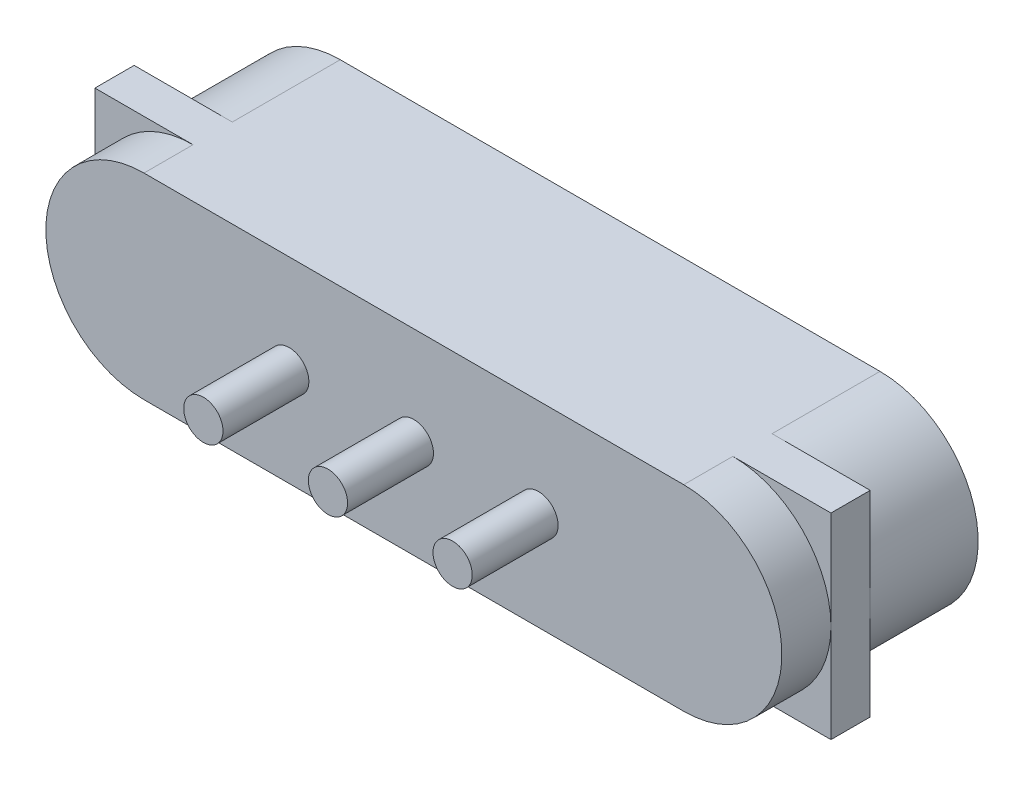
ISO-10303-21;
HEADER;
FILE_DESCRIPTION(('STEP AP214'),'2;1');
FILE_NAME('part.step','',(''),(''),'','','');
FILE_SCHEMA(('AUTOMOTIVE_DESIGN { 1 0 10303 214 1 1 1 1 }'));
ENDSEC;
DATA;
#1=APPLICATION_CONTEXT('core data for automotive mechanical design processes');
#2=APPLICATION_PROTOCOL_DEFINITION('international standard','automotive_design',2000,#1);
#3=PRODUCT_CONTEXT('',#1,'mechanical');
#4=PRODUCT('Part','Part','',(#3));
#5=PRODUCT_RELATED_PRODUCT_CATEGORY('part','',(#4));
#6=PRODUCT_DEFINITION_FORMATION('','',#4);
#7=PRODUCT_DEFINITION_CONTEXT('part definition',#1,'design');
#8=PRODUCT_DEFINITION('design','',#6,#7);
#9=PRODUCT_DEFINITION_SHAPE('','',#8);
#10=(LENGTH_UNIT() NAMED_UNIT(*) SI_UNIT(.MILLI.,.METRE.));
#11=(NAMED_UNIT(*) PLANE_ANGLE_UNIT() SI_UNIT($,.RADIAN.));
#12=(NAMED_UNIT(*) SI_UNIT($,.STERADIAN.) SOLID_ANGLE_UNIT());
#13=UNCERTAINTY_MEASURE_WITH_UNIT(LENGTH_MEASURE(1.E-05),#10,'distance_accuracy_value','');
#14=(GEOMETRIC_REPRESENTATION_CONTEXT(3) GLOBAL_UNCERTAINTY_ASSIGNED_CONTEXT((#13)) GLOBAL_UNIT_ASSIGNED_CONTEXT((#10,
#11,#12)) REPRESENTATION_CONTEXT('',''));
#15=CARTESIAN_POINT('',(0.,0.,0.));
#16=DIRECTION('',(0.,0.,1.));
#17=DIRECTION('',(1.,0.,0.));
#18=AXIS2_PLACEMENT_3D('',#15,#16,#17);
#19=CARTESIAN_POINT('',(0.,0.,4.));
#20=DIRECTION('',(0.,0.,-1.));
#21=DIRECTION('',(-1.,0.,0.));
#22=AXIS2_PLACEMENT_3D('',#19,#20,#21);
#23=CYLINDRICAL_SURFACE('',#22,2.);
#24=CARTESIAN_POINT('',(0.,0.,3.));
#25=DIRECTION('',(0.,0.,-1.));
#26=DIRECTION('',(-1.,0.,0.));
#27=AXIS2_PLACEMENT_3D('',#24,#25,#26);
#28=CIRCLE('',#27,2.);
#29=CARTESIAN_POINT('',(-2.,0.,3.));
#30=VERTEX_POINT('',#29);
#31=CARTESIAN_POINT('',(0.,2.,3.));
#32=VERTEX_POINT('',#31);
#33=EDGE_CURVE('E199',#30,#32,#28,.T.);
#34=ORIENTED_EDGE('',*,*,#33,.F.);
#35=CARTESIAN_POINT('',(0.,-2.,3.));
#36=VERTEX_POINT('',#35);
#37=EDGE_CURVE('E197',#36,#30,#28,.T.);
#38=ORIENTED_EDGE('',*,*,#37,.F.);
#39=DIRECTION('',(0.,0.,-1.));
#40=VECTOR('',#39,1.);
#41=CARTESIAN_POINT('',(0.,-2.,4.));
#42=LINE('',#41,#40);
#43=CARTESIAN_POINT('',(0.,-2.,4.));
#44=VERTEX_POINT('',#43);
#45=EDGE_CURVE('E233',#44,#36,#42,.T.);
#46=ORIENTED_EDGE('',*,*,#45,.F.);
#47=CARTESIAN_POINT('',(0.,0.,4.));
#48=DIRECTION('',(0.,0.,1.));
#49=DIRECTION('',(1.,0.,0.));
#50=AXIS2_PLACEMENT_3D('',#47,#48,#49);
#51=CIRCLE('',#50,2.);
#52=CARTESIAN_POINT('',(0.,2.,4.));
#53=VERTEX_POINT('',#52);
#54=EDGE_CURVE('E200',#53,#44,#51,.T.);
#55=ORIENTED_EDGE('',*,*,#54,.F.);
#56=DIRECTION('',(0.,0.,-1.));
#57=VECTOR('',#56,1.);
#58=CARTESIAN_POINT('',(0.,2.,4.));
#59=LINE('',#58,#57);
#60=EDGE_CURVE('E222',#53,#32,#59,.T.);
#61=ORIENTED_EDGE('',*,*,#60,.T.);
#62=EDGE_LOOP('',(#34,#38,#46,#55,#61));
#63=FACE_BOUND('',#62,.T.);
#64=ADVANCED_FACE('F32',(#63),#23,.T.);
#65=CARTESIAN_POINT('',(11.,0.,4.));
#66=DIRECTION('',(0.,0.,-1.));
#67=DIRECTION('',(-1.,0.,0.));
#68=AXIS2_PLACEMENT_3D('',#65,#66,#67);
#69=CYLINDRICAL_SURFACE('',#68,2.);
#70=CARTESIAN_POINT('',(11.,0.,3.));
#71=DIRECTION('',(0.,0.,-1.));
#72=DIRECTION('',(-1.,0.,0.));
#73=AXIS2_PLACEMENT_3D('',#70,#71,#72);
#74=CIRCLE('',#73,2.);
#75=CARTESIAN_POINT('',(11.,2.,3.));
#76=VERTEX_POINT('',#75);
#77=CARTESIAN_POINT('',(13.,0.,3.));
#78=VERTEX_POINT('',#77);
#79=EDGE_CURVE('E196',#76,#78,#74,.T.);
#80=ORIENTED_EDGE('',*,*,#79,.F.);
#81=DIRECTION('',(0.,0.,-1.));
#82=VECTOR('',#81,1.);
#83=CARTESIAN_POINT('',(11.,2.,4.));
#84=LINE('',#83,#82);
#85=CARTESIAN_POINT('',(11.,2.,4.));
#86=VERTEX_POINT('',#85);
#87=EDGE_CURVE('E226',#86,#76,#84,.T.);
#88=ORIENTED_EDGE('',*,*,#87,.F.);
#89=CARTESIAN_POINT('',(11.,0.,4.));
#90=DIRECTION('',(0.,0.,1.));
#91=DIRECTION('',(1.,0.,0.));
#92=AXIS2_PLACEMENT_3D('',#89,#90,#91);
#93=CIRCLE('',#92,2.);
#94=CARTESIAN_POINT('',(11.,-2.,4.));
#95=VERTEX_POINT('',#94);
#96=EDGE_CURVE('E206',#95,#86,#93,.T.);
#97=ORIENTED_EDGE('',*,*,#96,.F.);
#98=DIRECTION('',(0.,0.,-1.));
#99=VECTOR('',#98,1.);
#100=CARTESIAN_POINT('',(11.,-2.,4.));
#101=LINE('',#100,#99);
#102=CARTESIAN_POINT('',(11.,-2.,3.));
#103=VERTEX_POINT('',#102);
#104=EDGE_CURVE('E230',#95,#103,#101,.T.);
#105=ORIENTED_EDGE('',*,*,#104,.T.);
#106=EDGE_CURVE('E158',#78,#103,#74,.T.);
#107=ORIENTED_EDGE('',*,*,#106,.F.);
#108=EDGE_LOOP('',(#80,#88,#97,#105,#107));
#109=FACE_BOUND('',#108,.T.);
#110=ADVANCED_FACE('F266',(#109),#69,.T.);
#111=CARTESIAN_POINT('',(0.,0.,2.2));
#112=DIRECTION('',(0.,0.,-1.));
#113=DIRECTION('',(-1.,0.,0.));
#114=AXIS2_PLACEMENT_3D('',#111,#112,#113);
#115=CIRCLE('',#114,2.);
#116=CARTESIAN_POINT('',(0.,-2.,2.2));
#117=VERTEX_POINT('',#116);
#118=CARTESIAN_POINT('',(-2.,0.,2.2));
#119=VERTEX_POINT('',#118);
#120=EDGE_CURVE('E191',#117,#119,#115,.T.);
#121=ORIENTED_EDGE('',*,*,#120,.T.);
#122=CARTESIAN_POINT('',(0.,2.,2.2));
#123=VERTEX_POINT('',#122);
#124=EDGE_CURVE('E194',#119,#123,#115,.T.);
#125=ORIENTED_EDGE('',*,*,#124,.T.);
#126=CARTESIAN_POINT('',(0.,2.,0.));
#127=VERTEX_POINT('',#126);
#128=EDGE_CURVE('E210',#123,#127,#59,.T.);
#129=ORIENTED_EDGE('',*,*,#128,.T.);
#130=CARTESIAN_POINT('',(0.,0.,0.));
#131=DIRECTION('',(0.,0.,1.));
#132=DIRECTION('',(1.,0.,0.));
#133=AXIS2_PLACEMENT_3D('',#130,#131,#132);
#134=CIRCLE('',#133,2.);
#135=CARTESIAN_POINT('',(0.,-2.,0.));
#136=VERTEX_POINT('',#135);
#137=EDGE_CURVE('E211',#127,#136,#134,.T.);
#138=ORIENTED_EDGE('',*,*,#137,.T.);
#139=EDGE_CURVE('E232',#117,#136,#42,.T.);
#140=ORIENTED_EDGE('',*,*,#139,.F.);
#141=EDGE_LOOP('',(#121,#125,#129,#138,#140));
#142=FACE_BOUND('',#141,.T.);
#143=ADVANCED_FACE('F269',(#142),#23,.T.);
#144=CARTESIAN_POINT('',(0.,-2.,4.));
#145=DIRECTION('',(0.,1.,0.));
#146=DIRECTION('',(-1.,0.,0.));
#147=AXIS2_PLACEMENT_3D('',#144,#145,#146);
#148=PLANE('',#147);
#149=CARTESIAN_POINT('',(11.,-2.,2.2));
#150=VERTEX_POINT('',#149);
#151=CARTESIAN_POINT('',(11.,-2.,0.));
#152=VERTEX_POINT('',#151);
#153=EDGE_CURVE('E229',#150,#152,#101,.T.);
#154=ORIENTED_EDGE('',*,*,#153,.F.);
#155=DIRECTION('',(-1.,0.,0.));
#156=VECTOR('',#155,1.);
#157=CARTESIAN_POINT('',(13.,-2.,2.2));
#158=LINE('',#157,#156);
#159=CARTESIAN_POINT('',(13.,-2.,2.2));
#160=VERTEX_POINT('',#159);
#161=EDGE_CURVE('E55',#160,#150,#158,.T.);
#162=ORIENTED_EDGE('',*,*,#161,.F.);
#163=DIRECTION('',(0.,0.,-1.));
#164=VECTOR('',#163,1.);
#165=CARTESIAN_POINT('',(13.,-2.,3.));
#166=LINE('',#165,#164);
#167=CARTESIAN_POINT('',(13.,-2.,3.));
#168=VERTEX_POINT('',#167);
#169=EDGE_CURVE('E138',#168,#160,#166,.T.);
#170=ORIENTED_EDGE('',*,*,#169,.F.);
#171=DIRECTION('',(-1.,0.,0.));
#172=VECTOR('',#171,1.);
#173=CARTESIAN_POINT('',(13.,-2.,3.));
#174=LINE('',#173,#172);
#175=EDGE_CURVE('E152',#168,#103,#174,.T.);
#176=ORIENTED_EDGE('',*,*,#175,.T.);
#177=ORIENTED_EDGE('',*,*,#104,.F.);
#178=DIRECTION('',(1.,0.,0.));
#179=VECTOR('',#178,1.);
#180=CARTESIAN_POINT('',(0.,-2.,4.));
#181=LINE('',#180,#179);
#182=EDGE_CURVE('E203',#44,#95,#181,.T.);
#183=ORIENTED_EDGE('',*,*,#182,.F.);
#184=ORIENTED_EDGE('',*,*,#45,.T.);
#185=CARTESIAN_POINT('',(-2.,-2.,3.));
#186=VERTEX_POINT('',#185);
#187=EDGE_CURVE('E160',#36,#186,#174,.T.);
#188=ORIENTED_EDGE('',*,*,#187,.T.);
#189=DIRECTION('',(0.,0.,-1.));
#190=VECTOR('',#189,1.);
#191=CARTESIAN_POINT('',(-2.,-2.,3.));
#192=LINE('',#191,#190);
#193=CARTESIAN_POINT('',(-2.,-2.,2.2));
#194=VERTEX_POINT('',#193);
#195=EDGE_CURVE('E154',#186,#194,#192,.T.);
#196=ORIENTED_EDGE('',*,*,#195,.T.);
#197=EDGE_CURVE('E173',#117,#194,#158,.T.);
#198=ORIENTED_EDGE('',*,*,#197,.F.);
#199=ORIENTED_EDGE('',*,*,#139,.T.);
#200=DIRECTION('',(1.,0.,0.));
#201=VECTOR('',#200,1.);
#202=CARTESIAN_POINT('',(0.,-2.,0.));
#203=LINE('',#202,#201);
#204=EDGE_CURVE('E214',#136,#152,#203,.T.);
#205=ORIENTED_EDGE('',*,*,#204,.T.);
#206=EDGE_LOOP('',(#154,#162,#170,#176,#177,#183,#184,#188,#196,#198,#199,#205));
#207=FACE_BOUND('',#206,.T.);
#208=ADVANCED_FACE('F150',(#207),#148,.F.);
#209=CARTESIAN_POINT('',(11.,2.,2.2));
#210=VERTEX_POINT('',#209);
#211=CARTESIAN_POINT('',(11.,2.,0.));
#212=VERTEX_POINT('',#211);
#213=EDGE_CURVE('E225',#210,#212,#84,.T.);
#214=ORIENTED_EDGE('',*,*,#213,.F.);
#215=CARTESIAN_POINT('',(11.,0.,2.2));
#216=DIRECTION('',(0.,0.,-1.));
#217=DIRECTION('',(-1.,0.,0.));
#218=AXIS2_PLACEMENT_3D('',#215,#216,#217);
#219=CIRCLE('',#218,2.);
#220=CARTESIAN_POINT('',(13.,0.,2.2));
#221=VERTEX_POINT('',#220);
#222=EDGE_CURVE('E190',#210,#221,#219,.T.);
#223=ORIENTED_EDGE('',*,*,#222,.T.);
#224=EDGE_CURVE('E183',#221,#150,#219,.T.);
#225=ORIENTED_EDGE('',*,*,#224,.T.);
#226=ORIENTED_EDGE('',*,*,#153,.T.);
#227=CARTESIAN_POINT('',(11.,0.,0.));
#228=DIRECTION('',(0.,0.,1.));
#229=DIRECTION('',(1.,0.,0.));
#230=AXIS2_PLACEMENT_3D('',#227,#228,#229);
#231=CIRCLE('',#230,2.);
#232=EDGE_CURVE('E217',#152,#212,#231,.T.);
#233=ORIENTED_EDGE('',*,*,#232,.T.);
#234=EDGE_LOOP('',(#214,#223,#225,#226,#233));
#235=FACE_BOUND('',#234,.T.);
#236=ADVANCED_FACE('F275',(#235),#69,.T.);
#237=CARTESIAN_POINT('',(0.,2.,4.));
#238=DIRECTION('',(0.,-1.,0.));
#239=DIRECTION('',(1.,0.,0.));
#240=AXIS2_PLACEMENT_3D('',#237,#238,#239);
#241=PLANE('',#240);
#242=ORIENTED_EDGE('',*,*,#128,.F.);
#243=DIRECTION('',(1.,0.,0.));
#244=VECTOR('',#243,1.);
#245=CARTESIAN_POINT('',(13.,2.,2.2));
#246=LINE('',#245,#244);
#247=CARTESIAN_POINT('',(-2.,2.,2.2));
#248=VERTEX_POINT('',#247);
#249=EDGE_CURVE('E145',#248,#123,#246,.T.);
#250=ORIENTED_EDGE('',*,*,#249,.F.);
#251=DIRECTION('',(0.,0.,-1.));
#252=VECTOR('',#251,1.);
#253=CARTESIAN_POINT('',(-2.,2.,3.));
#254=LINE('',#253,#252);
#255=CARTESIAN_POINT('',(-2.,2.,3.));
#256=VERTEX_POINT('',#255);
#257=EDGE_CURVE('E184',#256,#248,#254,.T.);
#258=ORIENTED_EDGE('',*,*,#257,.F.);
#259=DIRECTION('',(1.,0.,0.));
#260=VECTOR('',#259,1.);
#261=CARTESIAN_POINT('',(13.,2.,3.));
#262=LINE('',#261,#260);
#263=EDGE_CURVE('E155',#256,#32,#262,.T.);
#264=ORIENTED_EDGE('',*,*,#263,.T.);
#265=ORIENTED_EDGE('',*,*,#60,.F.);
#266=DIRECTION('',(-1.,0.,0.));
#267=VECTOR('',#266,1.);
#268=CARTESIAN_POINT('',(0.,2.,4.));
#269=LINE('',#268,#267);
#270=EDGE_CURVE('E208',#86,#53,#269,.T.);
#271=ORIENTED_EDGE('',*,*,#270,.F.);
#272=ORIENTED_EDGE('',*,*,#87,.T.);
#273=CARTESIAN_POINT('',(13.,2.,3.));
#274=VERTEX_POINT('',#273);
#275=EDGE_CURVE('E167',#76,#274,#262,.T.);
#276=ORIENTED_EDGE('',*,*,#275,.T.);
#277=DIRECTION('',(0.,0.,-1.));
#278=VECTOR('',#277,1.);
#279=CARTESIAN_POINT('',(13.,2.,3.));
#280=LINE('',#279,#278);
#281=CARTESIAN_POINT('',(13.,2.,2.2));
#282=VERTEX_POINT('',#281);
#283=EDGE_CURVE('E180',#274,#282,#280,.T.);
#284=ORIENTED_EDGE('',*,*,#283,.T.);
#285=EDGE_CURVE('E178',#210,#282,#246,.T.);
#286=ORIENTED_EDGE('',*,*,#285,.F.);
#287=ORIENTED_EDGE('',*,*,#213,.T.);
#288=DIRECTION('',(-1.,0.,0.));
#289=VECTOR('',#288,1.);
#290=CARTESIAN_POINT('',(0.,2.,0.));
#291=LINE('',#290,#289);
#292=EDGE_CURVE('E204',#212,#127,#291,.T.);
#293=ORIENTED_EDGE('',*,*,#292,.T.);
#294=EDGE_LOOP('',(#242,#250,#258,#264,#265,#271,#272,#276,#284,#286,#287,#293));
#295=FACE_BOUND('',#294,.T.);
#296=ADVANCED_FACE('F299',(#295),#241,.F.);
#297=CARTESIAN_POINT('',(0.,0.,4.));
#298=DIRECTION('',(0.,0.,1.));
#299=DIRECTION('',(1.,0.,0.));
#300=AXIS2_PLACEMENT_3D('',#297,#298,#299);
#301=PLANE('',#300);
#302=CARTESIAN_POINT('',(2.96,0.,4.));
#303=DIRECTION('',(0.,0.,1.));
#304=DIRECTION('',(1.,0.,0.));
#305=AXIS2_PLACEMENT_3D('',#302,#303,#304);
#306=CIRCLE('',#305,0.4);
#307=CARTESIAN_POINT('',(3.36,0.,4.));
#308=VERTEX_POINT('',#307);
#309=EDGE_CURVE('E510',#308,#308,#306,.T.);
#310=ORIENTED_EDGE('',*,*,#309,.F.);
#311=EDGE_LOOP('',(#310));
#312=FACE_BOUND('',#311,.T.);
#313=CARTESIAN_POINT('',(8.04,0.,4.));
#314=DIRECTION('',(0.,0.,1.));
#315=DIRECTION('',(1.,0.,0.));
#316=AXIS2_PLACEMENT_3D('',#313,#314,#315);
#317=CIRCLE('',#316,0.400000000000001);
#318=CARTESIAN_POINT('',(8.44,0.,4.));
#319=VERTEX_POINT('',#318);
#320=EDGE_CURVE('E509',#319,#319,#317,.T.);
#321=ORIENTED_EDGE('',*,*,#320,.F.);
#322=EDGE_LOOP('',(#321));
#323=FACE_BOUND('',#322,.T.);
#324=CARTESIAN_POINT('',(5.5,0.,4.));
#325=DIRECTION('',(0.,0.,1.));
#326=DIRECTION('',(1.,0.,0.));
#327=AXIS2_PLACEMENT_3D('',#324,#325,#326);
#328=CIRCLE('',#327,0.400000000000001);
#329=CARTESIAN_POINT('',(5.9,0.,4.));
#330=VERTEX_POINT('',#329);
#331=EDGE_CURVE('E519',#330,#330,#328,.T.);
#332=ORIENTED_EDGE('',*,*,#331,.F.);
#333=EDGE_LOOP('',(#332));
#334=FACE_BOUND('',#333,.T.);
#335=ORIENTED_EDGE('',*,*,#54,.T.);
#336=ORIENTED_EDGE('',*,*,#182,.T.);
#337=ORIENTED_EDGE('',*,*,#96,.T.);
#338=ORIENTED_EDGE('',*,*,#270,.T.);
#339=EDGE_LOOP('',(#335,#336,#337,#338));
#340=FACE_BOUND('',#339,.T.);
#341=ADVANCED_FACE('F324',(#312,#323,#334,#340),#301,.T.);
#342=CARTESIAN_POINT('',(0.,0.,0.));
#343=DIRECTION('',(0.,0.,1.));
#344=DIRECTION('',(1.,0.,0.));
#345=AXIS2_PLACEMENT_3D('',#342,#343,#344);
#346=PLANE('',#345);
#347=CARTESIAN_POINT('',(2.96,0.,0.));
#348=DIRECTION('',(0.,0.,1.));
#349=DIRECTION('',(1.,0.,0.));
#350=AXIS2_PLACEMENT_3D('',#347,#348,#349);
#351=CIRCLE('',#350,0.5);
#352=CARTESIAN_POINT('',(3.46,0.,0.));
#353=VERTEX_POINT('',#352);
#354=EDGE_CURVE('E242',#353,#353,#351,.F.);
#355=ORIENTED_EDGE('',*,*,#354,.F.);
#356=EDGE_LOOP('',(#355));
#357=FACE_BOUND('',#356,.T.);
#358=CARTESIAN_POINT('',(5.5,0.,0.));
#359=DIRECTION('',(0.,0.,1.));
#360=DIRECTION('',(1.,0.,0.));
#361=AXIS2_PLACEMENT_3D('',#358,#359,#360);
#362=CIRCLE('',#361,0.500000000000001);
#363=CARTESIAN_POINT('',(6.,0.,0.));
#364=VERTEX_POINT('',#363);
#365=EDGE_CURVE('E239',#364,#364,#362,.F.);
#366=ORIENTED_EDGE('',*,*,#365,.F.);
#367=EDGE_LOOP('',(#366));
#368=FACE_BOUND('',#367,.T.);
#369=CARTESIAN_POINT('',(8.04,0.,0.));
#370=DIRECTION('',(0.,0.,1.));
#371=DIRECTION('',(1.,0.,0.));
#372=AXIS2_PLACEMENT_3D('',#369,#370,#371);
#373=CIRCLE('',#372,0.500000000000001);
#374=CARTESIAN_POINT('',(8.54,0.,0.));
#375=VERTEX_POINT('',#374);
#376=EDGE_CURVE('E236',#375,#375,#373,.F.);
#377=ORIENTED_EDGE('',*,*,#376,.F.);
#378=EDGE_LOOP('',(#377));
#379=FACE_BOUND('',#378,.T.);
#380=ORIENTED_EDGE('',*,*,#137,.F.);
#381=ORIENTED_EDGE('',*,*,#292,.F.);
#382=ORIENTED_EDGE('',*,*,#232,.F.);
#383=ORIENTED_EDGE('',*,*,#204,.F.);
#384=EDGE_LOOP('',(#380,#381,#382,#383));
#385=FACE_BOUND('',#384,.T.);
#386=ADVANCED_FACE('F304',(#357,#368,#379,#385),#346,.F.);
#387=CARTESIAN_POINT('',(13.,2.,3.));
#388=DIRECTION('',(1.,0.,0.));
#389=DIRECTION('',(0.,0.,-1.));
#390=AXIS2_PLACEMENT_3D('',#387,#388,#389);
#391=PLANE('',#390);
#392=DIRECTION('',(0.,-1.,0.));
#393=VECTOR('',#392,1.);
#394=CARTESIAN_POINT('',(13.,2.,2.2));
#395=LINE('',#394,#393);
#396=EDGE_CURVE('E174',#221,#160,#395,.T.);
#397=ORIENTED_EDGE('',*,*,#396,.F.);
#398=EDGE_CURVE('E170',#282,#221,#395,.T.);
#399=ORIENTED_EDGE('',*,*,#398,.F.);
#400=ORIENTED_EDGE('',*,*,#283,.F.);
#401=DIRECTION('',(0.,-1.,0.));
#402=VECTOR('',#401,1.);
#403=CARTESIAN_POINT('',(13.,2.,3.));
#404=LINE('',#403,#402);
#405=EDGE_CURVE('E141',#274,#78,#404,.T.);
#406=ORIENTED_EDGE('',*,*,#405,.T.);
#407=EDGE_CURVE('E134',#78,#168,#404,.T.);
#408=ORIENTED_EDGE('',*,*,#407,.T.);
#409=ORIENTED_EDGE('',*,*,#169,.T.);
#410=EDGE_LOOP('',(#397,#399,#400,#406,#408,#409));
#411=FACE_BOUND('',#410,.T.);
#412=ADVANCED_FACE('F137',(#411),#391,.T.);
#413=CARTESIAN_POINT('',(0.,0.,2.2));
#414=DIRECTION('',(0.,0.,-1.));
#415=DIRECTION('',(-1.,0.,0.));
#416=AXIS2_PLACEMENT_3D('',#413,#414,#415);
#417=PLANE('',#416);
#418=ORIENTED_EDGE('',*,*,#224,.F.);
#419=ORIENTED_EDGE('',*,*,#396,.T.);
#420=ORIENTED_EDGE('',*,*,#161,.T.);
#421=EDGE_LOOP('',(#418,#419,#420));
#422=FACE_BOUND('',#421,.T.);
#423=ADVANCED_FACE('F309',(#422),#417,.T.);
#424=CARTESIAN_POINT('',(0.,0.,3.));
#425=DIRECTION('',(0.,0.,-1.));
#426=DIRECTION('',(-1.,0.,0.));
#427=AXIS2_PLACEMENT_3D('',#424,#425,#426);
#428=PLANE('',#427);
#429=ORIENTED_EDGE('',*,*,#407,.F.);
#430=ORIENTED_EDGE('',*,*,#106,.T.);
#431=ORIENTED_EDGE('',*,*,#175,.F.);
#432=EDGE_LOOP('',(#429,#430,#431));
#433=FACE_BOUND('',#432,.T.);
#434=ADVANCED_FACE('F157',(#433),#428,.F.);
#435=ORIENTED_EDGE('',*,*,#222,.F.);
#436=ORIENTED_EDGE('',*,*,#285,.T.);
#437=ORIENTED_EDGE('',*,*,#398,.T.);
#438=EDGE_LOOP('',(#435,#436,#437));
#439=FACE_BOUND('',#438,.T.);
#440=ADVANCED_FACE('F313',(#439),#417,.T.);
#441=ORIENTED_EDGE('',*,*,#275,.F.);
#442=ORIENTED_EDGE('',*,*,#79,.T.);
#443=ORIENTED_EDGE('',*,*,#405,.F.);
#444=EDGE_LOOP('',(#441,#442,#443));
#445=FACE_BOUND('',#444,.T.);
#446=ADVANCED_FACE('F316',(#445),#428,.F.);
#447=CARTESIAN_POINT('',(-2.,2.,3.));
#448=DIRECTION('',(-1.,0.,0.));
#449=DIRECTION('',(0.,0.,1.));
#450=AXIS2_PLACEMENT_3D('',#447,#448,#449);
#451=PLANE('',#450);
#452=DIRECTION('',(0.,1.,0.));
#453=VECTOR('',#452,1.);
#454=CARTESIAN_POINT('',(-2.,2.,2.2));
#455=LINE('',#454,#453);
#456=EDGE_CURVE('E176',#119,#248,#455,.T.);
#457=ORIENTED_EDGE('',*,*,#456,.F.);
#458=EDGE_CURVE('E47',#194,#119,#455,.T.);
#459=ORIENTED_EDGE('',*,*,#458,.F.);
#460=ORIENTED_EDGE('',*,*,#195,.F.);
#461=DIRECTION('',(0.,1.,0.));
#462=VECTOR('',#461,1.);
#463=CARTESIAN_POINT('',(-2.,2.,3.));
#464=LINE('',#463,#462);
#465=EDGE_CURVE('E162',#186,#30,#464,.T.);
#466=ORIENTED_EDGE('',*,*,#465,.T.);
#467=EDGE_CURVE('E159',#30,#256,#464,.T.);
#468=ORIENTED_EDGE('',*,*,#467,.T.);
#469=ORIENTED_EDGE('',*,*,#257,.T.);
#470=EDGE_LOOP('',(#457,#459,#460,#466,#468,#469));
#471=FACE_BOUND('',#470,.T.);
#472=ADVANCED_FACE('F293',(#471),#451,.T.);
#473=ORIENTED_EDGE('',*,*,#467,.F.);
#474=ORIENTED_EDGE('',*,*,#33,.T.);
#475=ORIENTED_EDGE('',*,*,#263,.F.);
#476=EDGE_LOOP('',(#473,#474,#475));
#477=FACE_BOUND('',#476,.T.);
#478=ADVANCED_FACE('F331',(#477),#428,.F.);
#479=ORIENTED_EDGE('',*,*,#187,.F.);
#480=ORIENTED_EDGE('',*,*,#37,.T.);
#481=ORIENTED_EDGE('',*,*,#465,.F.);
#482=EDGE_LOOP('',(#479,#480,#481));
#483=FACE_BOUND('',#482,.T.);
#484=ADVANCED_FACE('F329',(#483),#428,.F.);
#485=ORIENTED_EDGE('',*,*,#124,.F.);
#486=ORIENTED_EDGE('',*,*,#456,.T.);
#487=ORIENTED_EDGE('',*,*,#249,.T.);
#488=EDGE_LOOP('',(#485,#486,#487));
#489=FACE_BOUND('',#488,.T.);
#490=ADVANCED_FACE('F297',(#489),#417,.T.);
#491=ORIENTED_EDGE('',*,*,#120,.F.);
#492=ORIENTED_EDGE('',*,*,#197,.T.);
#493=ORIENTED_EDGE('',*,*,#458,.T.);
#494=EDGE_LOOP('',(#491,#492,#493));
#495=FACE_BOUND('',#494,.T.);
#496=ADVANCED_FACE('F288',(#495),#417,.T.);
#497=CARTESIAN_POINT('',(8.04,0.,-1.));
#498=DIRECTION('',(0.,0.,1.));
#499=DIRECTION('',(1.,0.,0.));
#500=AXIS2_PLACEMENT_3D('',#497,#498,#499);
#501=CYLINDRICAL_SURFACE('',#500,0.500000000000001);
#502=CARTESIAN_POINT('',(8.04,0.,-0.5));
#503=DIRECTION('',(0.,0.,1.));
#504=DIRECTION('',(1.,0.,0.));
#505=AXIS2_PLACEMENT_3D('',#502,#503,#504);
#506=CIRCLE('',#505,0.500000000000001);
#507=CARTESIAN_POINT('',(8.54,0.,-0.5));
#508=VERTEX_POINT('',#507);
#509=EDGE_CURVE('E245',#508,#508,#506,.T.);
#510=ORIENTED_EDGE('',*,*,#509,.T.);
#511=EDGE_LOOP('',(#510));
#512=FACE_BOUND('',#511,.T.);
#513=ORIENTED_EDGE('',*,*,#376,.T.);
#514=EDGE_LOOP('',(#513));
#515=FACE_BOUND('',#514,.T.);
#516=ADVANCED_FACE('F381',(#512,#515),#501,.T.);
#517=CARTESIAN_POINT('',(5.5,0.,-1.));
#518=DIRECTION('',(0.,0.,1.));
#519=DIRECTION('',(1.,0.,0.));
#520=AXIS2_PLACEMENT_3D('',#517,#518,#519);
#521=CYLINDRICAL_SURFACE('',#520,0.500000000000001);
#522=CARTESIAN_POINT('',(5.5,0.,-0.5));
#523=DIRECTION('',(0.,0.,1.));
#524=DIRECTION('',(1.,0.,0.));
#525=AXIS2_PLACEMENT_3D('',#522,#523,#524);
#526=CIRCLE('',#525,0.500000000000001);
#527=CARTESIAN_POINT('',(6.,0.,-0.5));
#528=VERTEX_POINT('',#527);
#529=EDGE_CURVE('E40',#528,#528,#526,.T.);
#530=ORIENTED_EDGE('',*,*,#529,.T.);
#531=EDGE_LOOP('',(#530));
#532=FACE_BOUND('',#531,.T.);
#533=ORIENTED_EDGE('',*,*,#365,.T.);
#534=EDGE_LOOP('',(#533));
#535=FACE_BOUND('',#534,.T.);
#536=ADVANCED_FACE('F250',(#532,#535),#521,.T.);
#537=CARTESIAN_POINT('',(2.96,0.,-1.));
#538=DIRECTION('',(0.,0.,1.));
#539=DIRECTION('',(1.,0.,0.));
#540=AXIS2_PLACEMENT_3D('',#537,#538,#539);
#541=CYLINDRICAL_SURFACE('',#540,0.5);
#542=CARTESIAN_POINT('',(2.96,0.,-0.5));
#543=DIRECTION('',(0.,0.,1.));
#544=DIRECTION('',(1.,0.,0.));
#545=AXIS2_PLACEMENT_3D('',#542,#543,#544);
#546=CIRCLE('',#545,0.5);
#547=CARTESIAN_POINT('',(3.46,0.,-0.5));
#548=VERTEX_POINT('',#547);
#549=EDGE_CURVE('E11',#548,#548,#546,.T.);
#550=ORIENTED_EDGE('',*,*,#549,.T.);
#551=EDGE_LOOP('',(#550));
#552=FACE_BOUND('',#551,.T.);
#553=ORIENTED_EDGE('',*,*,#354,.T.);
#554=EDGE_LOOP('',(#553));
#555=FACE_BOUND('',#554,.T.);
#556=ADVANCED_FACE('F262',(#552,#555),#541,.T.);
#557=CARTESIAN_POINT('',(8.04,0.,-0.5));
#558=DIRECTION('',(0.,0.,-1.));
#559=DIRECTION('',(-1.,0.,0.));
#560=AXIS2_PLACEMENT_3D('',#557,#558,#559);
#561=SPHERICAL_SURFACE('',#560,0.5);
#562=ORIENTED_EDGE('',*,*,#509,.F.);
#563=EDGE_LOOP('',(#562));
#564=FACE_BOUND('',#563,.T.);
#565=ADVANCED_FACE('F255',(#564),#561,.T.);
#566=CARTESIAN_POINT('',(5.5,0.,-0.5));
#567=DIRECTION('',(0.,0.,-1.));
#568=DIRECTION('',(-1.,0.,0.));
#569=AXIS2_PLACEMENT_3D('',#566,#567,#568);
#570=SPHERICAL_SURFACE('',#569,0.5);
#571=ORIENTED_EDGE('',*,*,#529,.F.);
#572=EDGE_LOOP('',(#571));
#573=FACE_BOUND('',#572,.T.);
#574=ADVANCED_FACE('F253',(#573),#570,.T.);
#575=CARTESIAN_POINT('',(2.96,0.,-0.5));
#576=DIRECTION('',(0.,0.,-1.));
#577=DIRECTION('',(-1.,0.,0.));
#578=AXIS2_PLACEMENT_3D('',#575,#576,#577);
#579=SPHERICAL_SURFACE('',#578,0.5);
#580=ORIENTED_EDGE('',*,*,#549,.F.);
#581=EDGE_LOOP('',(#580));
#582=FACE_BOUND('',#581,.T.);
#583=ADVANCED_FACE('F34',(#582),#579,.T.);
#584=CARTESIAN_POINT('',(5.5,0.,5.75));
#585=DIRECTION('',(0.,0.,-1.));
#586=DIRECTION('',(-1.,0.,0.));
#587=AXIS2_PLACEMENT_3D('',#584,#585,#586);
#588=CYLINDRICAL_SURFACE('',#587,0.400000000000001);
#589=CARTESIAN_POINT('',(5.5,0.,5.75));
#590=DIRECTION('',(0.,0.,1.));
#591=DIRECTION('',(1.,0.,0.));
#592=AXIS2_PLACEMENT_3D('',#589,#590,#591);
#593=CIRCLE('',#592,0.400000000000001);
#594=CARTESIAN_POINT('',(5.9,0.,5.75));
#595=VERTEX_POINT('',#594);
#596=EDGE_CURVE('E311',#595,#595,#593,.T.);
#597=ORIENTED_EDGE('',*,*,#596,.F.);
#598=EDGE_LOOP('',(#597));
#599=FACE_BOUND('',#598,.T.);
#600=ORIENTED_EDGE('',*,*,#331,.T.);
#601=EDGE_LOOP('',(#600));
#602=FACE_BOUND('',#601,.T.);
#603=ADVANCED_FACE('F260',(#599,#602),#588,.T.);
#604=CARTESIAN_POINT('',(5.5,0.,5.75));
#605=DIRECTION('',(0.,0.,1.));
#606=DIRECTION('',(1.,0.,0.));
#607=AXIS2_PLACEMENT_3D('',#604,#605,#606);
#608=PLANE('',#607);
#609=ORIENTED_EDGE('',*,*,#596,.T.);
#610=EDGE_LOOP('',(#609));
#611=FACE_BOUND('',#610,.T.);
#612=ADVANCED_FACE('F452',(#611),#608,.T.);
#613=CARTESIAN_POINT('',(8.04,0.,5.75));
#614=DIRECTION('',(0.,0.,-1.));
#615=DIRECTION('',(-1.,0.,0.));
#616=AXIS2_PLACEMENT_3D('',#613,#614,#615);
#617=CYLINDRICAL_SURFACE('',#616,0.400000000000001);
#618=CARTESIAN_POINT('',(8.04,0.,5.75));
#619=DIRECTION('',(0.,0.,1.));
#620=DIRECTION('',(1.,0.,0.));
#621=AXIS2_PLACEMENT_3D('',#618,#619,#620);
#622=CIRCLE('',#621,0.400000000000001);
#623=CARTESIAN_POINT('',(8.44,0.,5.75));
#624=VERTEX_POINT('',#623);
#625=EDGE_CURVE('E513',#624,#624,#622,.T.);
#626=ORIENTED_EDGE('',*,*,#625,.F.);
#627=EDGE_LOOP('',(#626));
#628=FACE_BOUND('',#627,.T.);
#629=ORIENTED_EDGE('',*,*,#320,.T.);
#630=EDGE_LOOP('',(#629));
#631=FACE_BOUND('',#630,.T.);
#632=ADVANCED_FACE('F462',(#628,#631),#617,.T.);
#633=CARTESIAN_POINT('',(8.04,0.,5.75));
#634=DIRECTION('',(0.,0.,1.));
#635=DIRECTION('',(1.,0.,0.));
#636=AXIS2_PLACEMENT_3D('',#633,#634,#635);
#637=PLANE('',#636);
#638=ORIENTED_EDGE('',*,*,#625,.T.);
#639=EDGE_LOOP('',(#638));
#640=FACE_BOUND('',#639,.T.);
#641=ADVANCED_FACE('F472',(#640),#637,.T.);
#642=CARTESIAN_POINT('',(2.96,0.,5.75));
#643=DIRECTION('',(0.,0.,-1.));
#644=DIRECTION('',(-1.,0.,0.));
#645=AXIS2_PLACEMENT_3D('',#642,#643,#644);
#646=CYLINDRICAL_SURFACE('',#645,0.4);
#647=CARTESIAN_POINT('',(2.96,0.,5.75));
#648=DIRECTION('',(0.,0.,1.));
#649=DIRECTION('',(1.,0.,0.));
#650=AXIS2_PLACEMENT_3D('',#647,#648,#649);
#651=CIRCLE('',#650,0.4);
#652=CARTESIAN_POINT('',(3.36,0.,5.75));
#653=VERTEX_POINT('',#652);
#654=EDGE_CURVE('E508',#653,#653,#651,.T.);
#655=ORIENTED_EDGE('',*,*,#654,.F.);
#656=EDGE_LOOP('',(#655));
#657=FACE_BOUND('',#656,.T.);
#658=ORIENTED_EDGE('',*,*,#309,.T.);
#659=EDGE_LOOP('',(#658));
#660=FACE_BOUND('',#659,.T.);
#661=ADVANCED_FACE('F482',(#657,#660),#646,.T.);
#662=CARTESIAN_POINT('',(2.96,0.,5.75));
#663=DIRECTION('',(0.,0.,1.));
#664=DIRECTION('',(1.,0.,0.));
#665=AXIS2_PLACEMENT_3D('',#662,#663,#664);
#666=PLANE('',#665);
#667=ORIENTED_EDGE('',*,*,#654,.T.);
#668=EDGE_LOOP('',(#667));
#669=FACE_BOUND('',#668,.T.);
#670=ADVANCED_FACE('F492',(#669),#666,.T.);
#671=CLOSED_SHELL('',(#64,#110,#143,#208,#236,#296,#341,#386,#412,#423,#434,#440,#446,#472,#478,
#484,#490,#496,#516,#536,#556,#565,#574,#583,#603,#612,#632,#641,#661,#670));
#672=MANIFOLD_SOLID_BREP('B2',#671);
#673=ADVANCED_BREP_SHAPE_REPRESENTATION('',(#18,#672),#14);
#674=SHAPE_DEFINITION_REPRESENTATION(#9,#673);
ENDSEC;
END-ISO-10303-21;
